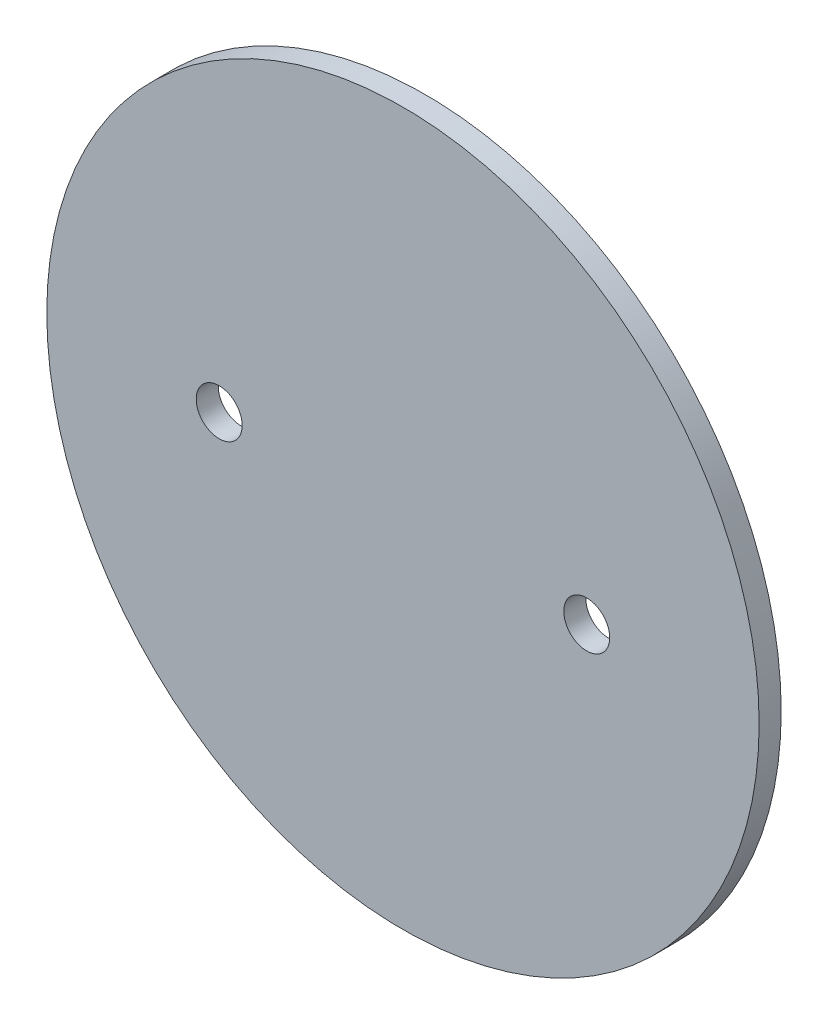
ISO-10303-21;
HEADER;
FILE_DESCRIPTION(('STEP AP214'),'2;1');
FILE_NAME('part.step','',(''),(''),'','','');
FILE_SCHEMA(('AUTOMOTIVE_DESIGN { 1 0 10303 214 1 1 1 1 }'));
ENDSEC;
DATA;
#1=APPLICATION_CONTEXT('core data for automotive mechanical design processes');
#2=APPLICATION_PROTOCOL_DEFINITION('international standard','automotive_design',2000,#1);
#3=PRODUCT_CONTEXT('',#1,'mechanical');
#4=PRODUCT('Part','Part','',(#3));
#5=PRODUCT_RELATED_PRODUCT_CATEGORY('part','',(#4));
#6=PRODUCT_DEFINITION_FORMATION('','',#4);
#7=PRODUCT_DEFINITION_CONTEXT('part definition',#1,'design');
#8=PRODUCT_DEFINITION('design','',#6,#7);
#9=PRODUCT_DEFINITION_SHAPE('','',#8);
#10=(LENGTH_UNIT() NAMED_UNIT(*) SI_UNIT(.MILLI.,.METRE.));
#11=(NAMED_UNIT(*) PLANE_ANGLE_UNIT() SI_UNIT($,.RADIAN.));
#12=(NAMED_UNIT(*) SI_UNIT($,.STERADIAN.) SOLID_ANGLE_UNIT());
#13=UNCERTAINTY_MEASURE_WITH_UNIT(LENGTH_MEASURE(1.E-05),#10,'distance_accuracy_value','');
#14=(GEOMETRIC_REPRESENTATION_CONTEXT(3) GLOBAL_UNCERTAINTY_ASSIGNED_CONTEXT((#13)) GLOBAL_UNIT_ASSIGNED_CONTEXT((#10,
#11,#12)) REPRESENTATION_CONTEXT('',''));
#15=CARTESIAN_POINT('',(0.,0.,0.));
#16=DIRECTION('',(0.,0.,1.));
#17=DIRECTION('',(1.,0.,0.));
#18=AXIS2_PLACEMENT_3D('',#15,#16,#17);
#19=CARTESIAN_POINT('',(0.,0.,3.));
#20=DIRECTION('',(0.,0.,1.));
#21=DIRECTION('',(1.,0.,0.));
#22=AXIS2_PLACEMENT_3D('',#19,#20,#21);
#23=PLANE('',#22);
#24=CARTESIAN_POINT('',(-50.,0.,3.));
#25=DIRECTION('',(0.,0.,1.));
#26=DIRECTION('',(1.,0.,0.));
#27=AXIS2_PLACEMENT_3D('',#24,#25,#26);
#28=CIRCLE('',#27,6.25);
#29=CARTESIAN_POINT('',(-43.75,0.,3.));
#30=VERTEX_POINT('',#29);
#31=EDGE_CURVE('E48',#30,#30,#28,.T.);
#32=ORIENTED_EDGE('',*,*,#31,.F.);
#33=EDGE_LOOP('',(#32));
#34=FACE_BOUND('',#33,.T.);
#35=CARTESIAN_POINT('',(0.,0.,3.));
#36=DIRECTION('',(0.,0.,1.));
#37=DIRECTION('',(1.,0.,0.));
#38=AXIS2_PLACEMENT_3D('',#35,#36,#37);
#39=CIRCLE('',#38,96.9);
#40=CARTESIAN_POINT('',(96.9,0.,3.));
#41=VERTEX_POINT('',#40);
#42=EDGE_CURVE('E10',#41,#41,#39,.T.);
#43=ORIENTED_EDGE('',*,*,#42,.T.);
#44=EDGE_LOOP('',(#43));
#45=FACE_BOUND('',#44,.T.);
#46=CARTESIAN_POINT('',(50.,0.,3.));
#47=DIRECTION('',(0.,0.,1.));
#48=DIRECTION('',(1.,0.,0.));
#49=AXIS2_PLACEMENT_3D('',#46,#47,#48);
#50=CIRCLE('',#49,6.25);
#51=CARTESIAN_POINT('',(56.25,0.,3.));
#52=VERTEX_POINT('',#51);
#53=EDGE_CURVE('E52',#52,#52,#50,.T.);
#54=ORIENTED_EDGE('',*,*,#53,.F.);
#55=EDGE_LOOP('',(#54));
#56=FACE_BOUND('',#55,.T.);
#57=ADVANCED_FACE('F40',(#34,#45,#56),#23,.T.);
#58=CARTESIAN_POINT('',(0.,0.,-3.));
#59=DIRECTION('',(0.,0.,1.));
#60=DIRECTION('',(1.,0.,0.));
#61=AXIS2_PLACEMENT_3D('',#58,#59,#60);
#62=PLANE('',#61);
#63=CARTESIAN_POINT('',(0.,0.,-3.));
#64=DIRECTION('',(0.,0.,1.));
#65=DIRECTION('',(1.,0.,0.));
#66=AXIS2_PLACEMENT_3D('',#63,#64,#65);
#67=CIRCLE('',#66,96.9);
#68=CARTESIAN_POINT('',(96.9,0.,-3.));
#69=VERTEX_POINT('',#68);
#70=EDGE_CURVE('E41',#69,#69,#67,.T.);
#71=ORIENTED_EDGE('',*,*,#70,.F.);
#72=EDGE_LOOP('',(#71));
#73=FACE_BOUND('',#72,.T.);
#74=CARTESIAN_POINT('',(-50.,0.,-3.));
#75=DIRECTION('',(0.,0.,1.));
#76=DIRECTION('',(1.,0.,0.));
#77=AXIS2_PLACEMENT_3D('',#74,#75,#76);
#78=CIRCLE('',#77,6.25);
#79=CARTESIAN_POINT('',(-43.75,0.,-3.));
#80=VERTEX_POINT('',#79);
#81=EDGE_CURVE('E49',#80,#80,#78,.T.);
#82=ORIENTED_EDGE('',*,*,#81,.T.);
#83=EDGE_LOOP('',(#82));
#84=FACE_BOUND('',#83,.T.);
#85=CARTESIAN_POINT('',(50.,0.,-3.));
#86=DIRECTION('',(0.,0.,1.));
#87=DIRECTION('',(1.,0.,0.));
#88=AXIS2_PLACEMENT_3D('',#85,#86,#87);
#89=CIRCLE('',#88,6.25);
#90=CARTESIAN_POINT('',(56.25,0.,-3.));
#91=VERTEX_POINT('',#90);
#92=EDGE_CURVE('E57',#91,#91,#89,.T.);
#93=ORIENTED_EDGE('',*,*,#92,.T.);
#94=EDGE_LOOP('',(#93));
#95=FACE_BOUND('',#94,.T.);
#96=ADVANCED_FACE('F67',(#73,#84,#95),#62,.F.);
#97=CARTESIAN_POINT('',(0.,0.,3.));
#98=DIRECTION('',(0.,0.,-1.));
#99=DIRECTION('',(-1.,0.,0.));
#100=AXIS2_PLACEMENT_3D('',#97,#98,#99);
#101=CYLINDRICAL_SURFACE('',#100,96.9);
#102=ORIENTED_EDGE('',*,*,#42,.F.);
#103=EDGE_LOOP('',(#102));
#104=FACE_BOUND('',#103,.T.);
#105=ORIENTED_EDGE('',*,*,#70,.T.);
#106=EDGE_LOOP('',(#105));
#107=FACE_BOUND('',#106,.T.);
#108=ADVANCED_FACE('F39',(#104,#107),#101,.T.);
#109=CARTESIAN_POINT('',(-50.,0.,3.));
#110=DIRECTION('',(0.,0.,-1.));
#111=DIRECTION('',(-1.,0.,0.));
#112=AXIS2_PLACEMENT_3D('',#109,#110,#111);
#113=CYLINDRICAL_SURFACE('',#112,6.25);
#114=ORIENTED_EDGE('',*,*,#31,.T.);
#115=EDGE_LOOP('',(#114));
#116=FACE_BOUND('',#115,.T.);
#117=ORIENTED_EDGE('',*,*,#81,.F.);
#118=EDGE_LOOP('',(#117));
#119=FACE_BOUND('',#118,.T.);
#120=ADVANCED_FACE('F75',(#116,#119),#113,.F.);
#121=CARTESIAN_POINT('',(50.,0.,3.));
#122=DIRECTION('',(0.,0.,-1.));
#123=DIRECTION('',(-1.,0.,0.));
#124=AXIS2_PLACEMENT_3D('',#121,#122,#123);
#125=CYLINDRICAL_SURFACE('',#124,6.25);
#126=ORIENTED_EDGE('',*,*,#53,.T.);
#127=EDGE_LOOP('',(#126));
#128=FACE_BOUND('',#127,.T.);
#129=ORIENTED_EDGE('',*,*,#92,.F.);
#130=EDGE_LOOP('',(#129));
#131=FACE_BOUND('',#130,.T.);
#132=ADVANCED_FACE('F62',(#128,#131),#125,.F.);
#133=CLOSED_SHELL('',(#57,#96,#108,#120,#132));
#134=MANIFOLD_SOLID_BREP('B2',#133);
#135=ADVANCED_BREP_SHAPE_REPRESENTATION('',(#18,#134),#14);
#136=SHAPE_DEFINITION_REPRESENTATION(#9,#135);
ENDSEC;
END-ISO-10303-21;
